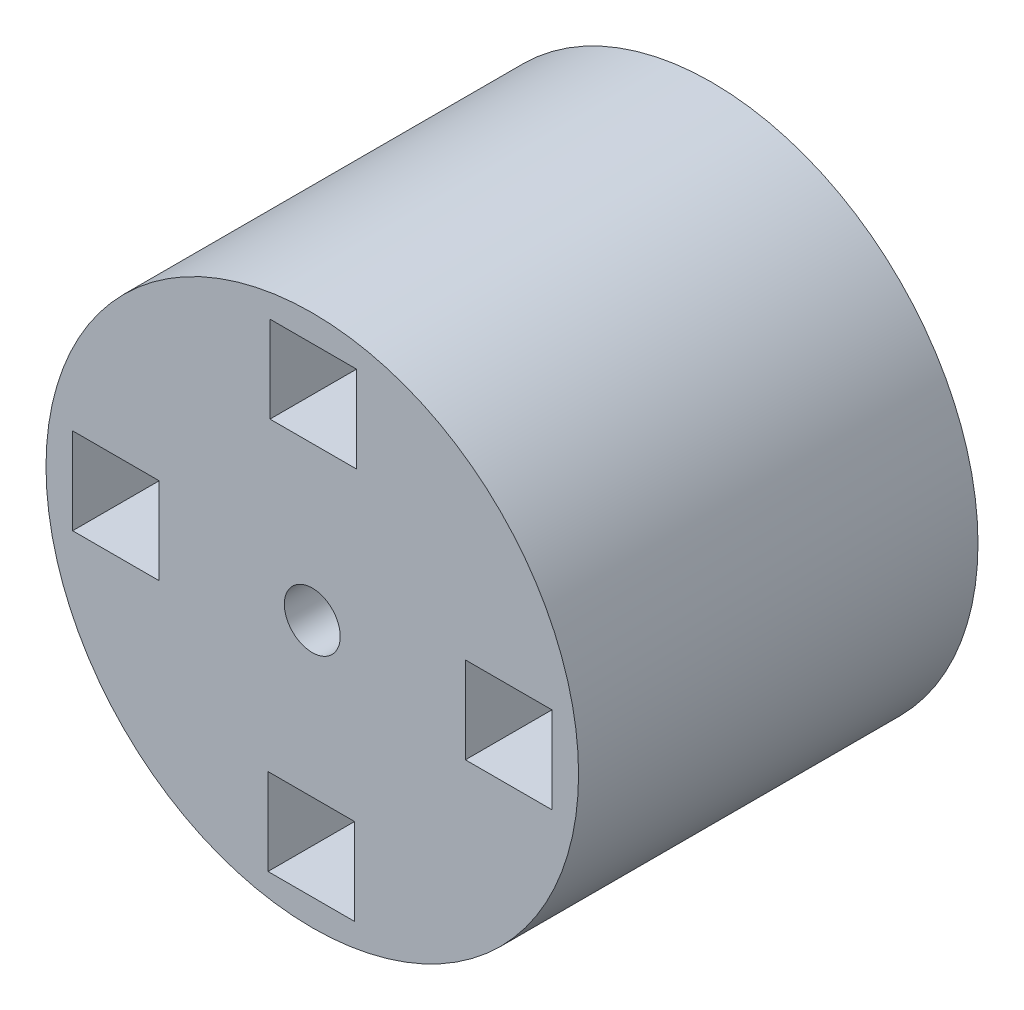
ISO-10303-21;
HEADER;
FILE_DESCRIPTION(('STEP AP214'),'2;1');
FILE_NAME('part.step','',(''),(''),'','','');
FILE_SCHEMA(('AUTOMOTIVE_DESIGN { 1 0 10303 214 1 1 1 1 }'));
ENDSEC;
DATA;
#1=APPLICATION_CONTEXT('core data for automotive mechanical design processes');
#2=APPLICATION_PROTOCOL_DEFINITION('international standard','automotive_design',2000,#1);
#3=PRODUCT_CONTEXT('',#1,'mechanical');
#4=PRODUCT('Part','Part','',(#3));
#5=PRODUCT_RELATED_PRODUCT_CATEGORY('part','',(#4));
#6=PRODUCT_DEFINITION_FORMATION('','',#4);
#7=PRODUCT_DEFINITION_CONTEXT('part definition',#1,'design');
#8=PRODUCT_DEFINITION('design','',#6,#7);
#9=PRODUCT_DEFINITION_SHAPE('','',#8);
#10=(LENGTH_UNIT() NAMED_UNIT(*) SI_UNIT(.MILLI.,.METRE.));
#11=(NAMED_UNIT(*) PLANE_ANGLE_UNIT() SI_UNIT($,.RADIAN.));
#12=(NAMED_UNIT(*) SI_UNIT($,.STERADIAN.) SOLID_ANGLE_UNIT());
#13=UNCERTAINTY_MEASURE_WITH_UNIT(LENGTH_MEASURE(1.E-05),#10,'distance_accuracy_value','');
#14=(GEOMETRIC_REPRESENTATION_CONTEXT(3) GLOBAL_UNCERTAINTY_ASSIGNED_CONTEXT((#13)) GLOBAL_UNIT_ASSIGNED_CONTEXT((#10,
#11,#12)) REPRESENTATION_CONTEXT('',''));
#15=CARTESIAN_POINT('',(0.,0.,0.));
#16=DIRECTION('',(0.,0.,1.));
#17=DIRECTION('',(1.,0.,0.));
#18=AXIS2_PLACEMENT_3D('',#15,#16,#17);
#19=CARTESIAN_POINT('',(-11.822558412063,14.5297529469992,0.));
#20=DIRECTION('',(0.,0.,1.));
#21=DIRECTION('',(1.,0.,0.));
#22=AXIS2_PLACEMENT_3D('',#19,#20,#21);
#23=PLANE('',#22);
#24=CARTESIAN_POINT('',(-11.822558412063,14.5297529469992,0.));
#25=DIRECTION('',(0.,0.,1.));
#26=DIRECTION('',(1.,0.,0.));
#27=AXIS2_PLACEMENT_3D('',#24,#25,#26);
#28=CIRCLE('',#27,0.999999999999999);
#29=CARTESIAN_POINT('',(-10.822558412063,14.5297529469992,0.));
#30=VERTEX_POINT('',#29);
#31=EDGE_CURVE('E278',#30,#30,#28,.T.);
#32=ORIENTED_EDGE('',*,*,#31,.T.);
#33=EDGE_LOOP('',(#32));
#34=FACE_BOUND('',#33,.T.);
#35=CARTESIAN_POINT('',(-11.822558412063,14.5297529469992,0.));
#36=DIRECTION('',(0.,0.,-1.));
#37=DIRECTION('',(-1.,0.,0.));
#38=AXIS2_PLACEMENT_3D('',#35,#36,#37);
#39=CIRCLE('',#38,5.5);
#40=CARTESIAN_POINT('',(-17.322558412063,14.5297529469992,0.));
#41=VERTEX_POINT('',#40);
#42=EDGE_CURVE('E327',#41,#41,#39,.T.);
#43=ORIENTED_EDGE('',*,*,#42,.T.);
#44=EDGE_LOOP('',(#43));
#45=FACE_BOUND('',#44,.T.);
#46=ADVANCED_FACE('F38',(#34,#45),#23,.F.);
#47=CARTESIAN_POINT('',(-11.822558412063,14.5297529469992,30.));
#48=DIRECTION('',(0.,0.,1.));
#49=DIRECTION('',(1.,0.,0.));
#50=AXIS2_PLACEMENT_3D('',#47,#48,#49);
#51=PLANE('',#50);
#52=DIRECTION('',(1.,0.,0.));
#53=VECTOR('',#52,1.);
#54=CARTESIAN_POINT('',(-8.64755841206307,-3.47024705300083,30.));
#55=LINE('',#54,#53);
#56=CARTESIAN_POINT('',(-15.1475584120631,-3.47024705300081,30.));
#57=VERTEX_POINT('',#56);
#58=CARTESIAN_POINT('',(-8.64755841206307,-3.47024705300083,30.));
#59=VERTEX_POINT('',#58);
#60=EDGE_CURVE('E54',#57,#59,#55,.T.);
#61=ORIENTED_EDGE('',*,*,#60,.F.);
#62=DIRECTION('',(0.,-1.,0.));
#63=VECTOR('',#62,1.);
#64=CARTESIAN_POINT('',(-15.1475584120631,-3.47024705300081,30.));
#65=LINE('',#64,#63);
#66=CARTESIAN_POINT('',(-15.1475584120631,3.02975294699919,30.));
#67=VERTEX_POINT('',#66);
#68=EDGE_CURVE('E176',#67,#57,#65,.T.);
#69=ORIENTED_EDGE('',*,*,#68,.F.);
#70=DIRECTION('',(-1.,0.,0.));
#71=VECTOR('',#70,1.);
#72=CARTESIAN_POINT('',(-8.64755841206305,3.02975294699917,30.));
#73=LINE('',#72,#71);
#74=CARTESIAN_POINT('',(-8.64755841206305,3.02975294699917,30.));
#75=VERTEX_POINT('',#74);
#76=EDGE_CURVE('E159',#75,#67,#73,.T.);
#77=ORIENTED_EDGE('',*,*,#76,.F.);
#78=DIRECTION('',(0.,1.,0.));
#79=VECTOR('',#78,1.);
#80=CARTESIAN_POINT('',(-8.64755841206307,-3.47024705300083,30.));
#81=LINE('',#80,#79);
#82=EDGE_CURVE('E169',#59,#75,#81,.T.);
#83=ORIENTED_EDGE('',*,*,#82,.F.);
#84=EDGE_LOOP('',(#61,#69,#77,#83));
#85=FACE_BOUND('',#84,.T.);
#86=DIRECTION('',(0.,-1.,0.));
#87=VECTOR('',#86,1.);
#88=CARTESIAN_POINT('',(-29.822558412063,11.3547529469992,30.));
#89=LINE('',#88,#87);
#90=CARTESIAN_POINT('',(-29.822558412063,17.8547529469992,30.));
#91=VERTEX_POINT('',#90);
#92=CARTESIAN_POINT('',(-29.822558412063,11.3547529469992,30.));
#93=VERTEX_POINT('',#92);
#94=EDGE_CURVE('E62',#91,#93,#89,.T.);
#95=ORIENTED_EDGE('',*,*,#94,.F.);
#96=DIRECTION('',(-1.,0.,0.));
#97=VECTOR('',#96,1.);
#98=CARTESIAN_POINT('',(-29.822558412063,17.8547529469992,30.));
#99=LINE('',#98,#97);
#100=CARTESIAN_POINT('',(-23.322558412063,17.8547529469992,30.));
#101=VERTEX_POINT('',#100);
#102=EDGE_CURVE('E205',#101,#91,#99,.T.);
#103=ORIENTED_EDGE('',*,*,#102,.F.);
#104=DIRECTION('',(0.,1.,0.));
#105=VECTOR('',#104,1.);
#106=CARTESIAN_POINT('',(-23.322558412063,11.3547529469992,30.));
#107=LINE('',#106,#105);
#108=CARTESIAN_POINT('',(-23.322558412063,11.3547529469992,30.));
#109=VERTEX_POINT('',#108);
#110=EDGE_CURVE('E202',#109,#101,#107,.T.);
#111=ORIENTED_EDGE('',*,*,#110,.F.);
#112=DIRECTION('',(1.,0.,0.));
#113=VECTOR('',#112,1.);
#114=CARTESIAN_POINT('',(-29.822558412063,11.3547529469992,30.));
#115=LINE('',#114,#113);
#116=EDGE_CURVE('E198',#93,#109,#115,.T.);
#117=ORIENTED_EDGE('',*,*,#116,.F.);
#118=EDGE_LOOP('',(#95,#103,#111,#117));
#119=FACE_BOUND('',#118,.T.);
#120=DIRECTION('',(-1.,0.,0.));
#121=VECTOR('',#120,1.);
#122=CARTESIAN_POINT('',(-14.9975584120628,32.5297529469992,30.));
#123=LINE('',#122,#121);
#124=CARTESIAN_POINT('',(-8.49755841206283,32.5297529469991,30.));
#125=VERTEX_POINT('',#124);
#126=CARTESIAN_POINT('',(-14.9975584120628,32.5297529469992,30.));
#127=VERTEX_POINT('',#126);
#128=EDGE_CURVE('E223',#125,#127,#123,.T.);
#129=ORIENTED_EDGE('',*,*,#128,.F.);
#130=DIRECTION('',(0.,1.,0.));
#131=VECTOR('',#130,1.);
#132=CARTESIAN_POINT('',(-8.49755841206283,32.5297529469991,30.));
#133=LINE('',#132,#131);
#134=CARTESIAN_POINT('',(-8.49755841206289,26.0297529469991,30.));
#135=VERTEX_POINT('',#134);
#136=EDGE_CURVE('E232',#135,#125,#133,.T.);
#137=ORIENTED_EDGE('',*,*,#136,.F.);
#138=DIRECTION('',(1.,0.,0.));
#139=VECTOR('',#138,1.);
#140=CARTESIAN_POINT('',(-14.9975584120629,26.0297529469992,30.));
#141=LINE('',#140,#139);
#142=CARTESIAN_POINT('',(-14.9975584120629,26.0297529469992,30.));
#143=VERTEX_POINT('',#142);
#144=EDGE_CURVE('E229',#143,#135,#141,.T.);
#145=ORIENTED_EDGE('',*,*,#144,.F.);
#146=DIRECTION('',(0.,-1.,0.));
#147=VECTOR('',#146,1.);
#148=CARTESIAN_POINT('',(-14.9975584120628,32.5297529469992,30.));
#149=LINE('',#148,#147);
#150=EDGE_CURVE('E225',#127,#143,#149,.T.);
#151=ORIENTED_EDGE('',*,*,#150,.F.);
#152=EDGE_LOOP('',(#129,#137,#145,#151));
#153=FACE_BOUND('',#152,.T.);
#154=DIRECTION('',(0.,1.,0.));
#155=VECTOR('',#154,1.);
#156=CARTESIAN_POINT('',(6.17744158793699,17.7047529469992,30.));
#157=LINE('',#156,#155);
#158=CARTESIAN_POINT('',(6.17744158793699,11.2047529469992,30.));
#159=VERTEX_POINT('',#158);
#160=CARTESIAN_POINT('',(6.17744158793699,17.7047529469992,30.));
#161=VERTEX_POINT('',#160);
#162=EDGE_CURVE('E187',#159,#161,#157,.T.);
#163=ORIENTED_EDGE('',*,*,#162,.F.);
#164=DIRECTION('',(1.,0.,0.));
#165=VECTOR('',#164,1.);
#166=CARTESIAN_POINT('',(6.17744158793699,11.2047529469992,30.));
#167=LINE('',#166,#165);
#168=CARTESIAN_POINT('',(-0.32255841206301,11.2047529469992,30.));
#169=VERTEX_POINT('',#168);
#170=EDGE_CURVE('E259',#169,#159,#167,.T.);
#171=ORIENTED_EDGE('',*,*,#170,.F.);
#172=DIRECTION('',(0.,-1.,0.));
#173=VECTOR('',#172,1.);
#174=CARTESIAN_POINT('',(-0.322558412063011,17.7047529469992,30.));
#175=LINE('',#174,#173);
#176=CARTESIAN_POINT('',(-0.322558412063011,17.7047529469992,30.));
#177=VERTEX_POINT('',#176);
#178=EDGE_CURVE('E256',#177,#169,#175,.T.);
#179=ORIENTED_EDGE('',*,*,#178,.F.);
#180=DIRECTION('',(-1.,0.,0.));
#181=VECTOR('',#180,1.);
#182=CARTESIAN_POINT('',(6.17744158793699,17.7047529469992,30.));
#183=LINE('',#182,#181);
#184=EDGE_CURVE('E253',#161,#177,#183,.T.);
#185=ORIENTED_EDGE('',*,*,#184,.F.);
#186=EDGE_LOOP('',(#163,#171,#179,#185));
#187=FACE_BOUND('',#186,.T.);
#188=CARTESIAN_POINT('',(-11.822558412063,14.5297529469992,30.));
#189=DIRECTION('',(0.,0.,1.));
#190=DIRECTION('',(1.,0.,0.));
#191=AXIS2_PLACEMENT_3D('',#188,#189,#190);
#192=CIRCLE('',#191,2.1);
#193=CARTESIAN_POINT('',(-9.72255841206301,14.5297529469992,30.));
#194=VERTEX_POINT('',#193);
#195=EDGE_CURVE('E271',#194,#194,#192,.T.);
#196=ORIENTED_EDGE('',*,*,#195,.F.);
#197=EDGE_LOOP('',(#196));
#198=FACE_BOUND('',#197,.T.);
#199=CARTESIAN_POINT('',(-11.822558412063,14.5297529469992,30.));
#200=DIRECTION('',(0.,0.,1.));
#201=DIRECTION('',(1.,0.,0.));
#202=AXIS2_PLACEMENT_3D('',#199,#200,#201);
#203=CIRCLE('',#202,20.);
#204=CARTESIAN_POINT('',(8.17744158793699,14.5297529469992,30.));
#205=VERTEX_POINT('',#204);
#206=EDGE_CURVE('E282',#205,#205,#203,.T.);
#207=ORIENTED_EDGE('',*,*,#206,.T.);
#208=EDGE_LOOP('',(#207));
#209=FACE_BOUND('',#208,.T.);
#210=ADVANCED_FACE('F173',(#85,#119,#153,#187,#198,#209),#51,.T.);
#211=CARTESIAN_POINT('',(-11.822558412063,14.5297529469992,0.));
#212=DIRECTION('',(0.,0.,-1.));
#213=DIRECTION('',(-1.,0.,0.));
#214=AXIS2_PLACEMENT_3D('',#211,#212,#213);
#215=CIRCLE('',#214,6.5);
#216=CARTESIAN_POINT('',(-18.322558412063,14.5297529469992,0.));
#217=VERTEX_POINT('',#216);
#218=EDGE_CURVE('E226',#217,#217,#215,.T.);
#219=ORIENTED_EDGE('',*,*,#218,.F.);
#220=EDGE_LOOP('',(#219));
#221=FACE_BOUND('',#220,.T.);
#222=CARTESIAN_POINT('',(-11.822558412063,14.5297529469992,0.));
#223=DIRECTION('',(0.,0.,1.));
#224=DIRECTION('',(1.,0.,0.));
#225=AXIS2_PLACEMENT_3D('',#222,#223,#224);
#226=CIRCLE('',#225,20.);
#227=CARTESIAN_POINT('',(8.17744158793699,14.5297529469992,0.));
#228=VERTEX_POINT('',#227);
#229=EDGE_CURVE('E281',#228,#228,#226,.T.);
#230=ORIENTED_EDGE('',*,*,#229,.F.);
#231=EDGE_LOOP('',(#230));
#232=FACE_BOUND('',#231,.T.);
#233=ADVANCED_FACE('F307',(#221,#232),#23,.F.);
#234=CARTESIAN_POINT('',(-11.822558412063,14.5297529469992,30.));
#235=DIRECTION('',(0.,0.,-1.));
#236=DIRECTION('',(-1.,0.,0.));
#237=AXIS2_PLACEMENT_3D('',#234,#235,#236);
#238=CYLINDRICAL_SURFACE('',#237,20.);
#239=ORIENTED_EDGE('',*,*,#206,.F.);
#240=EDGE_LOOP('',(#239));
#241=FACE_BOUND('',#240,.T.);
#242=ORIENTED_EDGE('',*,*,#229,.T.);
#243=EDGE_LOOP('',(#242));
#244=FACE_BOUND('',#243,.T.);
#245=ADVANCED_FACE('F314',(#241,#244),#238,.T.);
#246=CARTESIAN_POINT('',(-11.822558412063,14.5297529469992,30.));
#247=DIRECTION('',(0.,0.,-1.));
#248=DIRECTION('',(-1.,0.,0.));
#249=AXIS2_PLACEMENT_3D('',#246,#247,#248);
#250=CYLINDRICAL_SURFACE('',#249,0.999999999999999);
#251=CARTESIAN_POINT('',(-11.822558412063,14.5297529469992,24.3390533190697));
#252=DIRECTION('',(0.,0.,1.));
#253=DIRECTION('',(1.,0.,0.));
#254=AXIS2_PLACEMENT_3D('',#251,#252,#253);
#255=CIRCLE('',#254,0.999999999999999);
#256=CARTESIAN_POINT('',(-10.822558412063,14.5297529469992,24.3390533190697));
#257=VERTEX_POINT('',#256);
#258=EDGE_CURVE('E277',#257,#257,#255,.F.);
#259=ORIENTED_EDGE('',*,*,#258,.F.);
#260=EDGE_LOOP('',(#259));
#261=FACE_BOUND('',#260,.T.);
#262=ORIENTED_EDGE('',*,*,#31,.F.);
#263=EDGE_LOOP('',(#262));
#264=FACE_BOUND('',#263,.T.);
#265=ADVANCED_FACE('F319',(#261,#264),#250,.F.);
#266=CARTESIAN_POINT('',(-11.822558412063,14.5297529469992,25.));
#267=DIRECTION('',(0.,0.,1.));
#268=DIRECTION('',(1.,0.,0.));
#269=AXIS2_PLACEMENT_3D('',#266,#267,#268);
#270=CONICAL_SURFACE('',#269,2.1,1.02974425867665);
#271=ORIENTED_EDGE('',*,*,#258,.T.);
#272=EDGE_LOOP('',(#271));
#273=FACE_BOUND('',#272,.T.);
#274=CARTESIAN_POINT('',(-11.822558412063,14.5297529469992,25.));
#275=DIRECTION('',(0.,0.,1.));
#276=DIRECTION('',(1.,0.,0.));
#277=AXIS2_PLACEMENT_3D('',#274,#275,#276);
#278=CIRCLE('',#277,2.1);
#279=CARTESIAN_POINT('',(-9.72255841206301,14.5297529469992,25.));
#280=VERTEX_POINT('',#279);
#281=EDGE_CURVE('E274',#280,#280,#278,.T.);
#282=ORIENTED_EDGE('',*,*,#281,.T.);
#283=EDGE_LOOP('',(#282));
#284=FACE_BOUND('',#283,.T.);
#285=ADVANCED_FACE('F418',(#273,#284),#270,.F.);
#286=CARTESIAN_POINT('',(-11.822558412063,14.5297529469992,30.));
#287=DIRECTION('',(0.,0.,1.));
#288=DIRECTION('',(1.,0.,0.));
#289=AXIS2_PLACEMENT_3D('',#286,#287,#288);
#290=CYLINDRICAL_SURFACE('',#289,2.1);
#291=ORIENTED_EDGE('',*,*,#281,.F.);
#292=EDGE_LOOP('',(#291));
#293=FACE_BOUND('',#292,.T.);
#294=ORIENTED_EDGE('',*,*,#195,.T.);
#295=EDGE_LOOP('',(#294));
#296=FACE_BOUND('',#295,.T.);
#297=ADVANCED_FACE('F414',(#293,#296),#290,.F.);
#298=CARTESIAN_POINT('',(6.17744158793699,17.7047529469992,-9.19238815542513));
#299=DIRECTION('',(1.,0.,0.));
#300=DIRECTION('',(0.,0.,-1.));
#301=AXIS2_PLACEMENT_3D('',#298,#299,#300);
#302=PLANE('',#301);
#303=DIRECTION('',(0.,-1.,0.));
#304=VECTOR('',#303,1.);
#305=CARTESIAN_POINT('',(6.17744158793699,17.7047529469992,2.5));
#306=LINE('',#305,#304);
#307=CARTESIAN_POINT('',(6.17744158793699,17.7047529469992,2.5));
#308=VERTEX_POINT('',#307);
#309=CARTESIAN_POINT('',(6.17744158793699,11.2047529469992,2.5));
#310=VERTEX_POINT('',#309);
#311=EDGE_CURVE('E249',#308,#310,#306,.T.);
#312=ORIENTED_EDGE('',*,*,#311,.T.);
#313=DIRECTION('',(0.,0.,1.));
#314=VECTOR('',#313,1.);
#315=CARTESIAN_POINT('',(6.17744158793699,11.2047529469992,-9.19238815542513));
#316=LINE('',#315,#314);
#317=EDGE_CURVE('E247',#310,#159,#316,.T.);
#318=ORIENTED_EDGE('',*,*,#317,.T.);
#319=ORIENTED_EDGE('',*,*,#162,.T.);
#320=DIRECTION('',(0.,0.,1.));
#321=VECTOR('',#320,1.);
#322=CARTESIAN_POINT('',(6.17744158793699,17.7047529469992,-9.19238815542513));
#323=LINE('',#322,#321);
#324=EDGE_CURVE('E262',#308,#161,#323,.T.);
#325=ORIENTED_EDGE('',*,*,#324,.F.);
#326=EDGE_LOOP('',(#312,#318,#319,#325));
#327=FACE_BOUND('',#326,.T.);
#328=ADVANCED_FACE('F404',(#327),#302,.F.);
#329=CARTESIAN_POINT('',(6.17744158793699,11.2047529469992,-9.19238815542513));
#330=DIRECTION('',(0.,-1.,0.));
#331=DIRECTION('',(1.,0.,0.));
#332=AXIS2_PLACEMENT_3D('',#329,#330,#331);
#333=PLANE('',#332);
#334=DIRECTION('',(-1.,0.,0.));
#335=VECTOR('',#334,1.);
#336=CARTESIAN_POINT('',(6.17744158793699,11.2047529469992,2.5));
#337=LINE('',#336,#335);
#338=CARTESIAN_POINT('',(-0.32255841206301,11.2047529469992,2.5));
#339=VERTEX_POINT('',#338);
#340=EDGE_CURVE('E246',#310,#339,#337,.T.);
#341=ORIENTED_EDGE('',*,*,#340,.T.);
#342=DIRECTION('',(0.,0.,1.));
#343=VECTOR('',#342,1.);
#344=CARTESIAN_POINT('',(-0.32255841206301,11.2047529469992,-9.19238815542513));
#345=LINE('',#344,#343);
#346=EDGE_CURVE('E264',#339,#169,#345,.T.);
#347=ORIENTED_EDGE('',*,*,#346,.T.);
#348=ORIENTED_EDGE('',*,*,#170,.T.);
#349=ORIENTED_EDGE('',*,*,#317,.F.);
#350=EDGE_LOOP('',(#341,#347,#348,#349));
#351=FACE_BOUND('',#350,.T.);
#352=ADVANCED_FACE('F400',(#351),#333,.F.);
#353=CARTESIAN_POINT('',(-0.322558412063011,17.7047529469992,-9.19238815542513));
#354=DIRECTION('',(-1.,0.,0.));
#355=DIRECTION('',(0.,-1.,0.));
#356=AXIS2_PLACEMENT_3D('',#353,#354,#355);
#357=PLANE('',#356);
#358=DIRECTION('',(0.,1.,0.));
#359=VECTOR('',#358,1.);
#360=CARTESIAN_POINT('',(-0.322558412063011,17.7047529469992,2.5));
#361=LINE('',#360,#359);
#362=CARTESIAN_POINT('',(-0.322558412063011,17.7047529469992,2.5));
#363=VERTEX_POINT('',#362);
#364=EDGE_CURVE('E244',#339,#363,#361,.T.);
#365=ORIENTED_EDGE('',*,*,#364,.T.);
#366=DIRECTION('',(0.,0.,1.));
#367=VECTOR('',#366,1.);
#368=CARTESIAN_POINT('',(-0.322558412063011,17.7047529469992,-9.19238815542513));
#369=LINE('',#368,#367);
#370=EDGE_CURVE('E266',#363,#177,#369,.T.);
#371=ORIENTED_EDGE('',*,*,#370,.T.);
#372=ORIENTED_EDGE('',*,*,#178,.T.);
#373=ORIENTED_EDGE('',*,*,#346,.F.);
#374=EDGE_LOOP('',(#365,#371,#372,#373));
#375=FACE_BOUND('',#374,.T.);
#376=ADVANCED_FACE('F403',(#375),#357,.F.);
#377=CARTESIAN_POINT('',(6.17744158793699,17.7047529469992,-9.19238815542513));
#378=DIRECTION('',(0.,1.,0.));
#379=DIRECTION('',(-1.,0.,0.));
#380=AXIS2_PLACEMENT_3D('',#377,#378,#379);
#381=PLANE('',#380);
#382=DIRECTION('',(1.,0.,0.));
#383=VECTOR('',#382,1.);
#384=CARTESIAN_POINT('',(6.17744158793699,17.7047529469992,2.5));
#385=LINE('',#384,#383);
#386=EDGE_CURVE('E251',#363,#308,#385,.T.);
#387=ORIENTED_EDGE('',*,*,#386,.T.);
#388=ORIENTED_EDGE('',*,*,#324,.T.);
#389=ORIENTED_EDGE('',*,*,#184,.T.);
#390=ORIENTED_EDGE('',*,*,#370,.F.);
#391=EDGE_LOOP('',(#387,#388,#389,#390));
#392=FACE_BOUND('',#391,.T.);
#393=ADVANCED_FACE('F398',(#392),#381,.F.);
#394=CARTESIAN_POINT('',(-11.822558412063,14.5297529469992,2.5));
#395=DIRECTION('',(0.,0.,1.));
#396=DIRECTION('',(1.,0.,0.));
#397=AXIS2_PLACEMENT_3D('',#394,#395,#396);
#398=PLANE('',#397);
#399=ORIENTED_EDGE('',*,*,#311,.F.);
#400=ORIENTED_EDGE('',*,*,#386,.F.);
#401=ORIENTED_EDGE('',*,*,#364,.F.);
#402=ORIENTED_EDGE('',*,*,#340,.F.);
#403=EDGE_LOOP('',(#399,#400,#401,#402));
#404=FACE_BOUND('',#403,.T.);
#405=ADVANCED_FACE('F394',(#404),#398,.T.);
#406=CARTESIAN_POINT('',(-14.9975584120628,32.5297529469992,-9.19238815542522));
#407=DIRECTION('',(0.,1.,0.));
#408=DIRECTION('',(-1.,0.,0.));
#409=AXIS2_PLACEMENT_3D('',#406,#407,#408);
#410=PLANE('',#409);
#411=DIRECTION('',(1.,0.,0.));
#412=VECTOR('',#411,1.);
#413=CARTESIAN_POINT('',(-14.9975584120628,32.5297529469992,2.5));
#414=LINE('',#413,#412);
#415=CARTESIAN_POINT('',(-14.9975584120628,32.5297529469992,2.5));
#416=VERTEX_POINT('',#415);
#417=CARTESIAN_POINT('',(-8.49755841206283,32.5297529469991,2.5));
#418=VERTEX_POINT('',#417);
#419=EDGE_CURVE('E221',#416,#418,#414,.T.);
#420=ORIENTED_EDGE('',*,*,#419,.T.);
#421=DIRECTION('',(0.,0.,1.));
#422=VECTOR('',#421,1.);
#423=CARTESIAN_POINT('',(-8.49755841206283,32.5297529469991,-9.19238815542522));
#424=LINE('',#423,#422);
#425=EDGE_CURVE('E219',#418,#125,#424,.T.);
#426=ORIENTED_EDGE('',*,*,#425,.T.);
#427=ORIENTED_EDGE('',*,*,#128,.T.);
#428=DIRECTION('',(0.,0.,1.));
#429=VECTOR('',#428,1.);
#430=CARTESIAN_POINT('',(-14.9975584120628,32.5297529469992,-9.19238815542522));
#431=LINE('',#430,#429);
#432=EDGE_CURVE('E235',#416,#127,#431,.T.);
#433=ORIENTED_EDGE('',*,*,#432,.F.);
#434=EDGE_LOOP('',(#420,#426,#427,#433));
#435=FACE_BOUND('',#434,.T.);
#436=ADVANCED_FACE('F384',(#435),#410,.F.);
#437=CARTESIAN_POINT('',(-8.49755841206283,32.5297529469991,-9.19238815542522));
#438=DIRECTION('',(1.,0.,0.));
#439=DIRECTION('',(0.,1.,0.));
#440=AXIS2_PLACEMENT_3D('',#437,#438,#439);
#441=PLANE('',#440);
#442=DIRECTION('',(0.,-1.,0.));
#443=VECTOR('',#442,1.);
#444=CARTESIAN_POINT('',(-8.49755841206283,32.5297529469991,2.5));
#445=LINE('',#444,#443);
#446=CARTESIAN_POINT('',(-8.49755841206289,26.0297529469991,2.5));
#447=VERTEX_POINT('',#446);
#448=EDGE_CURVE('E218',#418,#447,#445,.T.);
#449=ORIENTED_EDGE('',*,*,#448,.T.);
#450=DIRECTION('',(0.,0.,1.));
#451=VECTOR('',#450,1.);
#452=CARTESIAN_POINT('',(-8.49755841206289,26.0297529469991,-9.19238815542522));
#453=LINE('',#452,#451);
#454=EDGE_CURVE('E237',#447,#135,#453,.T.);
#455=ORIENTED_EDGE('',*,*,#454,.T.);
#456=ORIENTED_EDGE('',*,*,#136,.T.);
#457=ORIENTED_EDGE('',*,*,#425,.F.);
#458=EDGE_LOOP('',(#449,#455,#456,#457));
#459=FACE_BOUND('',#458,.T.);
#460=ADVANCED_FACE('F380',(#459),#441,.F.);
#461=CARTESIAN_POINT('',(-14.9975584120629,26.0297529469992,-9.19238815542522));
#462=DIRECTION('',(0.,-1.,0.));
#463=DIRECTION('',(1.,0.,0.));
#464=AXIS2_PLACEMENT_3D('',#461,#462,#463);
#465=PLANE('',#464);
#466=DIRECTION('',(-1.,0.,0.));
#467=VECTOR('',#466,1.);
#468=CARTESIAN_POINT('',(-14.9975584120629,26.0297529469992,2.5));
#469=LINE('',#468,#467);
#470=CARTESIAN_POINT('',(-14.9975584120629,26.0297529469992,2.5));
#471=VERTEX_POINT('',#470);
#472=EDGE_CURVE('E216',#447,#471,#469,.T.);
#473=ORIENTED_EDGE('',*,*,#472,.T.);
#474=DIRECTION('',(0.,0.,1.));
#475=VECTOR('',#474,1.);
#476=CARTESIAN_POINT('',(-14.9975584120629,26.0297529469992,-9.19238815542522));
#477=LINE('',#476,#475);
#478=EDGE_CURVE('E239',#471,#143,#477,.T.);
#479=ORIENTED_EDGE('',*,*,#478,.T.);
#480=ORIENTED_EDGE('',*,*,#144,.T.);
#481=ORIENTED_EDGE('',*,*,#454,.F.);
#482=EDGE_LOOP('',(#473,#479,#480,#481));
#483=FACE_BOUND('',#482,.T.);
#484=ADVANCED_FACE('F383',(#483),#465,.F.);
#485=CARTESIAN_POINT('',(-14.9975584120628,32.5297529469992,-9.19238815542522));
#486=DIRECTION('',(-1.,0.,0.));
#487=DIRECTION('',(0.,-1.,0.));
#488=AXIS2_PLACEMENT_3D('',#485,#486,#487);
#489=PLANE('',#488);
#490=DIRECTION('',(0.,1.,0.));
#491=VECTOR('',#490,1.);
#492=CARTESIAN_POINT('',(-14.9975584120628,32.5297529469992,2.5));
#493=LINE('',#492,#491);
#494=EDGE_CURVE('E199',#471,#416,#493,.T.);
#495=ORIENTED_EDGE('',*,*,#494,.T.);
#496=ORIENTED_EDGE('',*,*,#432,.T.);
#497=ORIENTED_EDGE('',*,*,#150,.T.);
#498=ORIENTED_EDGE('',*,*,#478,.F.);
#499=EDGE_LOOP('',(#495,#496,#497,#498));
#500=FACE_BOUND('',#499,.T.);
#501=ADVANCED_FACE('F378',(#500),#489,.F.);
#502=CARTESIAN_POINT('',(-11.822558412063,14.5297529469992,2.5));
#503=DIRECTION('',(0.,0.,1.));
#504=DIRECTION('',(1.,0.,0.));
#505=AXIS2_PLACEMENT_3D('',#502,#503,#504);
#506=PLANE('',#505);
#507=ORIENTED_EDGE('',*,*,#419,.F.);
#508=ORIENTED_EDGE('',*,*,#494,.F.);
#509=ORIENTED_EDGE('',*,*,#472,.F.);
#510=ORIENTED_EDGE('',*,*,#448,.F.);
#511=EDGE_LOOP('',(#507,#508,#509,#510));
#512=FACE_BOUND('',#511,.T.);
#513=ADVANCED_FACE('F375',(#512),#506,.T.);
#514=CARTESIAN_POINT('',(-29.822558412063,11.3547529469992,-9.19238815542513));
#515=DIRECTION('',(-1.,0.,0.));
#516=DIRECTION('',(0.,0.,1.));
#517=AXIS2_PLACEMENT_3D('',#514,#515,#516);
#518=PLANE('',#517);
#519=DIRECTION('',(0.,1.,0.));
#520=VECTOR('',#519,1.);
#521=CARTESIAN_POINT('',(-29.822558412063,11.3547529469992,2.5));
#522=LINE('',#521,#520);
#523=CARTESIAN_POINT('',(-29.822558412063,11.3547529469992,2.5));
#524=VERTEX_POINT('',#523);
#525=CARTESIAN_POINT('',(-29.822558412063,17.8547529469992,2.5));
#526=VERTEX_POINT('',#525);
#527=EDGE_CURVE('E194',#524,#526,#522,.T.);
#528=ORIENTED_EDGE('',*,*,#527,.T.);
#529=DIRECTION('',(0.,0.,1.));
#530=VECTOR('',#529,1.);
#531=CARTESIAN_POINT('',(-29.822558412063,17.8547529469992,-9.19238815542513));
#532=LINE('',#531,#530);
#533=EDGE_CURVE('E192',#526,#91,#532,.T.);
#534=ORIENTED_EDGE('',*,*,#533,.T.);
#535=ORIENTED_EDGE('',*,*,#94,.T.);
#536=DIRECTION('',(0.,0.,1.));
#537=VECTOR('',#536,1.);
#538=CARTESIAN_POINT('',(-29.822558412063,11.3547529469992,-9.19238815542513));
#539=LINE('',#538,#537);
#540=EDGE_CURVE('E208',#524,#93,#539,.T.);
#541=ORIENTED_EDGE('',*,*,#540,.F.);
#542=EDGE_LOOP('',(#528,#534,#535,#541));
#543=FACE_BOUND('',#542,.T.);
#544=ADVANCED_FACE('F365',(#543),#518,.F.);
#545=CARTESIAN_POINT('',(-29.822558412063,17.8547529469992,-9.19238815542513));
#546=DIRECTION('',(0.,1.,0.));
#547=DIRECTION('',(-1.,0.,0.));
#548=AXIS2_PLACEMENT_3D('',#545,#546,#547);
#549=PLANE('',#548);
#550=DIRECTION('',(1.,0.,0.));
#551=VECTOR('',#550,1.);
#552=CARTESIAN_POINT('',(-29.822558412063,17.8547529469992,2.5));
#553=LINE('',#552,#551);
#554=CARTESIAN_POINT('',(-23.322558412063,17.8547529469992,2.5));
#555=VERTEX_POINT('',#554);
#556=EDGE_CURVE('E191',#526,#555,#553,.T.);
#557=ORIENTED_EDGE('',*,*,#556,.T.);
#558=DIRECTION('',(0.,0.,1.));
#559=VECTOR('',#558,1.);
#560=CARTESIAN_POINT('',(-23.322558412063,17.8547529469992,-9.19238815542513));
#561=LINE('',#560,#559);
#562=EDGE_CURVE('E210',#555,#101,#561,.T.);
#563=ORIENTED_EDGE('',*,*,#562,.T.);
#564=ORIENTED_EDGE('',*,*,#102,.T.);
#565=ORIENTED_EDGE('',*,*,#533,.F.);
#566=EDGE_LOOP('',(#557,#563,#564,#565));
#567=FACE_BOUND('',#566,.T.);
#568=ADVANCED_FACE('F361',(#567),#549,.F.);
#569=CARTESIAN_POINT('',(-23.322558412063,11.3547529469992,-9.19238815542513));
#570=DIRECTION('',(1.,0.,0.));
#571=DIRECTION('',(0.,1.,0.));
#572=AXIS2_PLACEMENT_3D('',#569,#570,#571);
#573=PLANE('',#572);
#574=DIRECTION('',(0.,-1.,0.));
#575=VECTOR('',#574,1.);
#576=CARTESIAN_POINT('',(-23.322558412063,11.3547529469992,2.5));
#577=LINE('',#576,#575);
#578=CARTESIAN_POINT('',(-23.322558412063,11.3547529469992,2.5));
#579=VERTEX_POINT('',#578);
#580=EDGE_CURVE('E189',#555,#579,#577,.T.);
#581=ORIENTED_EDGE('',*,*,#580,.T.);
#582=DIRECTION('',(0.,0.,1.));
#583=VECTOR('',#582,1.);
#584=CARTESIAN_POINT('',(-23.322558412063,11.3547529469992,-9.19238815542513));
#585=LINE('',#584,#583);
#586=EDGE_CURVE('E212',#579,#109,#585,.T.);
#587=ORIENTED_EDGE('',*,*,#586,.T.);
#588=ORIENTED_EDGE('',*,*,#110,.T.);
#589=ORIENTED_EDGE('',*,*,#562,.F.);
#590=EDGE_LOOP('',(#581,#587,#588,#589));
#591=FACE_BOUND('',#590,.T.);
#592=ADVANCED_FACE('F364',(#591),#573,.F.);
#593=CARTESIAN_POINT('',(-29.822558412063,11.3547529469992,-9.19238815542513));
#594=DIRECTION('',(0.,-1.,0.));
#595=DIRECTION('',(1.,0.,0.));
#596=AXIS2_PLACEMENT_3D('',#593,#594,#595);
#597=PLANE('',#596);
#598=DIRECTION('',(-1.,0.,0.));
#599=VECTOR('',#598,1.);
#600=CARTESIAN_POINT('',(-29.822558412063,11.3547529469992,2.5));
#601=LINE('',#600,#599);
#602=EDGE_CURVE('E196',#579,#524,#601,.T.);
#603=ORIENTED_EDGE('',*,*,#602,.T.);
#604=ORIENTED_EDGE('',*,*,#540,.T.);
#605=ORIENTED_EDGE('',*,*,#116,.T.);
#606=ORIENTED_EDGE('',*,*,#586,.F.);
#607=EDGE_LOOP('',(#603,#604,#605,#606));
#608=FACE_BOUND('',#607,.T.);
#609=ADVANCED_FACE('F359',(#608),#597,.F.);
#610=CARTESIAN_POINT('',(-11.822558412063,14.5297529469992,2.5));
#611=DIRECTION('',(0.,0.,1.));
#612=DIRECTION('',(1.,0.,0.));
#613=AXIS2_PLACEMENT_3D('',#610,#611,#612);
#614=PLANE('',#613);
#615=ORIENTED_EDGE('',*,*,#527,.F.);
#616=ORIENTED_EDGE('',*,*,#602,.F.);
#617=ORIENTED_EDGE('',*,*,#580,.F.);
#618=ORIENTED_EDGE('',*,*,#556,.F.);
#619=EDGE_LOOP('',(#615,#616,#617,#618));
#620=FACE_BOUND('',#619,.T.);
#621=ADVANCED_FACE('F350',(#620),#614,.T.);
#622=CARTESIAN_POINT('',(-8.64755841206307,-3.47024705300083,-9.19238815542515));
#623=DIRECTION('',(0.,-1.,0.));
#624=DIRECTION('',(1.,0.,0.));
#625=AXIS2_PLACEMENT_3D('',#622,#623,#624);
#626=PLANE('',#625);
#627=DIRECTION('',(-1.,0.,0.));
#628=VECTOR('',#627,1.);
#629=CARTESIAN_POINT('',(-8.64755841206307,-3.47024705300083,2.5));
#630=LINE('',#629,#628);
#631=CARTESIAN_POINT('',(-8.64755841206307,-3.47024705300083,2.5));
#632=VERTEX_POINT('',#631);
#633=CARTESIAN_POINT('',(-15.1475584120631,-3.47024705300081,2.5));
#634=VERTEX_POINT('',#633);
#635=EDGE_CURVE('E188',#632,#634,#630,.T.);
#636=ORIENTED_EDGE('',*,*,#635,.T.);
#637=DIRECTION('',(0.,0.,1.));
#638=VECTOR('',#637,1.);
#639=CARTESIAN_POINT('',(-15.1475584120631,-3.47024705300081,-9.19238815542515));
#640=LINE('',#639,#638);
#641=EDGE_CURVE('E181',#634,#57,#640,.T.);
#642=ORIENTED_EDGE('',*,*,#641,.T.);
#643=ORIENTED_EDGE('',*,*,#60,.T.);
#644=DIRECTION('',(0.,0.,1.));
#645=VECTOR('',#644,1.);
#646=CARTESIAN_POINT('',(-8.64755841206307,-3.47024705300083,-9.19238815542515));
#647=LINE('',#646,#645);
#648=EDGE_CURVE('E166',#632,#59,#647,.T.);
#649=ORIENTED_EDGE('',*,*,#648,.F.);
#650=EDGE_LOOP('',(#636,#642,#643,#649));
#651=FACE_BOUND('',#650,.T.);
#652=ADVANCED_FACE('F337',(#651),#626,.F.);
#653=CARTESIAN_POINT('',(-15.1475584120631,-3.47024705300081,-9.19238815542515));
#654=DIRECTION('',(-1.,0.,0.));
#655=DIRECTION('',(0.,-1.,0.));
#656=AXIS2_PLACEMENT_3D('',#653,#654,#655);
#657=PLANE('',#656);
#658=DIRECTION('',(0.,1.,0.));
#659=VECTOR('',#658,1.);
#660=CARTESIAN_POINT('',(-15.1475584120631,-3.47024705300081,2.5));
#661=LINE('',#660,#659);
#662=CARTESIAN_POINT('',(-15.1475584120631,3.02975294699919,2.5));
#663=VERTEX_POINT('',#662);
#664=EDGE_CURVE('E333',#634,#663,#661,.T.);
#665=ORIENTED_EDGE('',*,*,#664,.T.);
#666=DIRECTION('',(0.,0.,1.));
#667=VECTOR('',#666,1.);
#668=CARTESIAN_POINT('',(-15.1475584120631,3.02975294699919,-9.19238815542515));
#669=LINE('',#668,#667);
#670=EDGE_CURVE('E165',#663,#67,#669,.T.);
#671=ORIENTED_EDGE('',*,*,#670,.T.);
#672=ORIENTED_EDGE('',*,*,#68,.T.);
#673=ORIENTED_EDGE('',*,*,#641,.F.);
#674=EDGE_LOOP('',(#665,#671,#672,#673));
#675=FACE_BOUND('',#674,.T.);
#676=ADVANCED_FACE('F342',(#675),#657,.F.);
#677=CARTESIAN_POINT('',(-8.64755841206305,3.02975294699917,-9.19238815542515));
#678=DIRECTION('',(0.,1.,0.));
#679=DIRECTION('',(-1.,0.,0.));
#680=AXIS2_PLACEMENT_3D('',#677,#678,#679);
#681=PLANE('',#680);
#682=DIRECTION('',(1.,0.,0.));
#683=VECTOR('',#682,1.);
#684=CARTESIAN_POINT('',(-8.64755841206305,3.02975294699917,2.5));
#685=LINE('',#684,#683);
#686=CARTESIAN_POINT('',(-8.64755841206305,3.02975294699917,2.5));
#687=VERTEX_POINT('',#686);
#688=EDGE_CURVE('E162',#663,#687,#685,.T.);
#689=ORIENTED_EDGE('',*,*,#688,.T.);
#690=DIRECTION('',(0.,0.,1.));
#691=VECTOR('',#690,1.);
#692=CARTESIAN_POINT('',(-8.64755841206305,3.02975294699917,-9.19238815542515));
#693=LINE('',#692,#691);
#694=EDGE_CURVE('E154',#687,#75,#693,.T.);
#695=ORIENTED_EDGE('',*,*,#694,.T.);
#696=ORIENTED_EDGE('',*,*,#76,.T.);
#697=ORIENTED_EDGE('',*,*,#670,.F.);
#698=EDGE_LOOP('',(#689,#695,#696,#697));
#699=FACE_BOUND('',#698,.T.);
#700=ADVANCED_FACE('F156',(#699),#681,.F.);
#701=CARTESIAN_POINT('',(-8.64755841206307,-3.47024705300083,-9.19238815542515));
#702=DIRECTION('',(1.,0.,0.));
#703=DIRECTION('',(0.,1.,0.));
#704=AXIS2_PLACEMENT_3D('',#701,#702,#703);
#705=PLANE('',#704);
#706=DIRECTION('',(0.,-1.,0.));
#707=VECTOR('',#706,1.);
#708=CARTESIAN_POINT('',(-8.64755841206307,-3.47024705300083,2.5));
#709=LINE('',#708,#707);
#710=EDGE_CURVE('E185',#687,#632,#709,.T.);
#711=ORIENTED_EDGE('',*,*,#710,.T.);
#712=ORIENTED_EDGE('',*,*,#648,.T.);
#713=ORIENTED_EDGE('',*,*,#82,.T.);
#714=ORIENTED_EDGE('',*,*,#694,.F.);
#715=EDGE_LOOP('',(#711,#712,#713,#714));
#716=FACE_BOUND('',#715,.T.);
#717=ADVANCED_FACE('F170',(#716),#705,.F.);
#718=CARTESIAN_POINT('',(-11.822558412063,14.5297529469992,2.5));
#719=DIRECTION('',(0.,0.,1.));
#720=DIRECTION('',(1.,0.,0.));
#721=AXIS2_PLACEMENT_3D('',#718,#719,#720);
#722=PLANE('',#721);
#723=ORIENTED_EDGE('',*,*,#635,.F.);
#724=ORIENTED_EDGE('',*,*,#710,.F.);
#725=ORIENTED_EDGE('',*,*,#688,.F.);
#726=ORIENTED_EDGE('',*,*,#664,.F.);
#727=EDGE_LOOP('',(#723,#724,#725,#726));
#728=FACE_BOUND('',#727,.T.);
#729=ADVANCED_FACE('F340',(#728),#722,.T.);
#730=CARTESIAN_POINT('',(-11.822558412063,14.5297529469992,1.));
#731=DIRECTION('',(0.,0.,-1.));
#732=DIRECTION('',(-1.,0.,0.));
#733=AXIS2_PLACEMENT_3D('',#730,#731,#732);
#734=CYLINDRICAL_SURFACE('',#733,6.5);
#735=CARTESIAN_POINT('',(-11.822558412063,14.5297529469992,0.5));
#736=DIRECTION('',(0.,0.,-1.));
#737=DIRECTION('',(-1.,0.,0.));
#738=AXIS2_PLACEMENT_3D('',#735,#736,#737);
#739=CIRCLE('',#738,6.5);
#740=CARTESIAN_POINT('',(-18.322558412063,14.5297529469992,0.5));
#741=VERTEX_POINT('',#740);
#742=EDGE_CURVE('E12',#741,#741,#739,.F.);
#743=ORIENTED_EDGE('',*,*,#742,.T.);
#744=EDGE_LOOP('',(#743));
#745=FACE_BOUND('',#744,.T.);
#746=ORIENTED_EDGE('',*,*,#218,.T.);
#747=EDGE_LOOP('',(#746));
#748=FACE_BOUND('',#747,.T.);
#749=ADVANCED_FACE('F536',(#745,#748),#734,.F.);
#750=CARTESIAN_POINT('',(-11.822558412063,14.5297529469992,1.));
#751=DIRECTION('',(0.,0.,-1.));
#752=DIRECTION('',(-1.,0.,0.));
#753=AXIS2_PLACEMENT_3D('',#750,#751,#752);
#754=CYLINDRICAL_SURFACE('',#753,5.5);
#755=CARTESIAN_POINT('',(-11.822558412063,14.5297529469992,0.5));
#756=DIRECTION('',(0.,0.,-1.));
#757=DIRECTION('',(-1.,0.,0.));
#758=AXIS2_PLACEMENT_3D('',#755,#756,#757);
#759=CIRCLE('',#758,5.5);
#760=CARTESIAN_POINT('',(-17.322558412063,14.5297529469992,0.5));
#761=VERTEX_POINT('',#760);
#762=EDGE_CURVE('E47',#761,#761,#759,.T.);
#763=ORIENTED_EDGE('',*,*,#762,.T.);
#764=EDGE_LOOP('',(#763));
#765=FACE_BOUND('',#764,.T.);
#766=ORIENTED_EDGE('',*,*,#42,.F.);
#767=EDGE_LOOP('',(#766));
#768=FACE_BOUND('',#767,.T.);
#769=ADVANCED_FACE('F292',(#765,#768),#754,.T.);
#770=CARTESIAN_POINT('',(-11.822558412063,14.5297529469992,0.5));
#771=DIRECTION('',(0.,0.,-1.));
#772=DIRECTION('',(-1.,0.,0.));
#773=AXIS2_PLACEMENT_3D('',#770,#771,#772);
#774=TOROIDAL_SURFACE('',#773,6.,0.5);
#775=ORIENTED_EDGE('',*,*,#742,.F.);
#776=EDGE_LOOP('',(#775));
#777=FACE_BOUND('',#776,.T.);
#778=CARTESIAN_POINT('',(-11.822558412063,14.5297529469992,1.));
#779=DIRECTION('',(0.,0.,-1.));
#780=DIRECTION('',(-1.,0.,0.));
#781=AXIS2_PLACEMENT_3D('',#778,#779,#780);
#782=CIRCLE('',#781,6.);
#783=CARTESIAN_POINT('',(-17.822558412063,14.5297529469992,1.));
#784=VERTEX_POINT('',#783);
#785=EDGE_CURVE('E42',#784,#784,#782,.T.);
#786=ORIENTED_EDGE('',*,*,#785,.F.);
#787=EDGE_LOOP('',(#786));
#788=FACE_BOUND('',#787,.T.);
#789=ADVANCED_FACE('F40',(#777,#788),#774,.F.);
#790=CARTESIAN_POINT('',(-11.822558412063,14.5297529469992,0.5));
#791=DIRECTION('',(0.,0.,-1.));
#792=DIRECTION('',(-1.,0.,0.));
#793=AXIS2_PLACEMENT_3D('',#790,#791,#792);
#794=TOROIDAL_SURFACE('',#793,6.,0.5);
#795=ORIENTED_EDGE('',*,*,#785,.T.);
#796=EDGE_LOOP('',(#795));
#797=FACE_BOUND('',#796,.T.);
#798=ORIENTED_EDGE('',*,*,#762,.F.);
#799=EDGE_LOOP('',(#798));
#800=FACE_BOUND('',#799,.T.);
#801=ADVANCED_FACE('F295',(#797,#800),#794,.F.);
#802=CLOSED_SHELL('',(#46,#210,#233,#245,#265,#285,#297,#328,#352,#376,#393,#405,#436,#460,#484,
#501,#513,#544,#568,#592,#609,#621,#652,#676,#700,#717,#729,#749,#769,#789,#801));
#803=MANIFOLD_SOLID_BREP('B2',#802);
#804=ADVANCED_BREP_SHAPE_REPRESENTATION('',(#18,#803),#14);
#805=SHAPE_DEFINITION_REPRESENTATION(#9,#804);
ENDSEC;
END-ISO-10303-21;
